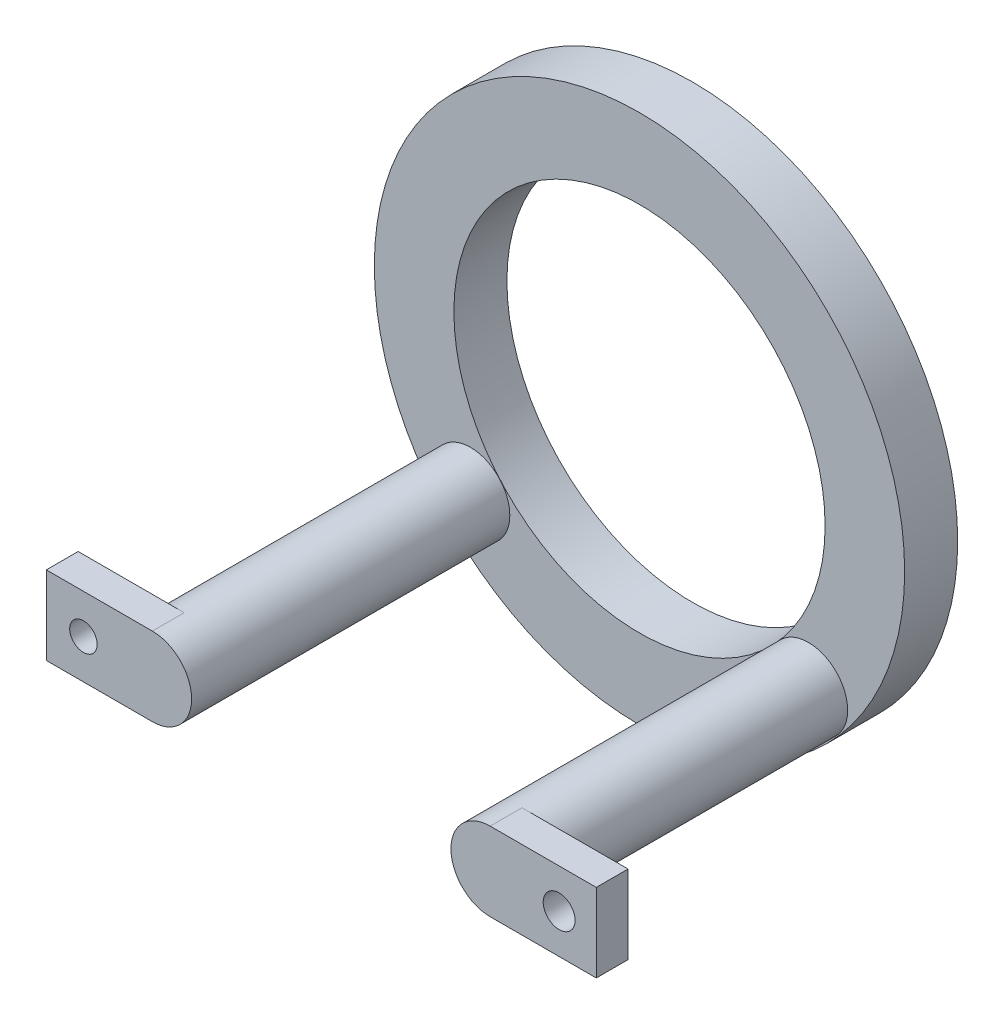
ISO-10303-21;
HEADER;
FILE_DESCRIPTION(('STEP AP214'),'2;1');
FILE_NAME('part.step','',(''),(''),'','','');
FILE_SCHEMA(('AUTOMOTIVE_DESIGN { 1 0 10303 214 1 1 1 1 }'));
ENDSEC;
DATA;
#1=APPLICATION_CONTEXT('core data for automotive mechanical design processes');
#2=APPLICATION_PROTOCOL_DEFINITION('international standard','automotive_design',2000,#1);
#3=PRODUCT_CONTEXT('',#1,'mechanical');
#4=PRODUCT('Part','Part','',(#3));
#5=PRODUCT_RELATED_PRODUCT_CATEGORY('part','',(#4));
#6=PRODUCT_DEFINITION_FORMATION('','',#4);
#7=PRODUCT_DEFINITION_CONTEXT('part definition',#1,'design');
#8=PRODUCT_DEFINITION('design','',#6,#7);
#9=PRODUCT_DEFINITION_SHAPE('','',#8);
#10=(LENGTH_UNIT() NAMED_UNIT(*) SI_UNIT(.MILLI.,.METRE.));
#11=(NAMED_UNIT(*) PLANE_ANGLE_UNIT() SI_UNIT($,.RADIAN.));
#12=(NAMED_UNIT(*) SI_UNIT($,.STERADIAN.) SOLID_ANGLE_UNIT());
#13=UNCERTAINTY_MEASURE_WITH_UNIT(LENGTH_MEASURE(1.E-05),#10,'distance_accuracy_value','');
#14=(GEOMETRIC_REPRESENTATION_CONTEXT(3) GLOBAL_UNCERTAINTY_ASSIGNED_CONTEXT((#13)) GLOBAL_UNIT_ASSIGNED_CONTEXT((#10,
#11,#12)) REPRESENTATION_CONTEXT('',''));
#15=CARTESIAN_POINT('',(0.,0.,0.));
#16=DIRECTION('',(0.,0.,1.));
#17=DIRECTION('',(1.,0.,0.));
#18=AXIS2_PLACEMENT_3D('',#15,#16,#17);
#19=CARTESIAN_POINT('',(0.,0.,10.));
#20=DIRECTION('',(0.,0.,1.));
#21=DIRECTION('',(1.,0.,0.));
#22=AXIS2_PLACEMENT_3D('',#19,#20,#21);
#23=PLANE('',#22);
#24=CARTESIAN_POINT('',(31.85,-28.,10.));
#25=DIRECTION('',(0.,0.,1.));
#26=DIRECTION('',(1.,0.,0.));
#27=AXIS2_PLACEMENT_3D('',#24,#25,#26);
#28=CIRCLE('',#27,7.4);
#29=CARTESIAN_POINT('',(39.25,-28.,10.));
#30=VERTEX_POINT('',#29);
#31=EDGE_CURVE('E202',#30,#30,#28,.F.);
#32=ORIENTED_EDGE('',*,*,#31,.T.);
#33=EDGE_LOOP('',(#32));
#34=FACE_BOUND('',#33,.T.);
#35=CARTESIAN_POINT('',(-31.85,-28.,10.));
#36=DIRECTION('',(0.,0.,1.));
#37=DIRECTION('',(1.,0.,0.));
#38=AXIS2_PLACEMENT_3D('',#35,#36,#37);
#39=CIRCLE('',#38,7.4);
#40=CARTESIAN_POINT('',(-24.45,-28.,10.));
#41=VERTEX_POINT('',#40);
#42=EDGE_CURVE('E209',#41,#41,#39,.F.);
#43=ORIENTED_EDGE('',*,*,#42,.T.);
#44=EDGE_LOOP('',(#43));
#45=FACE_BOUND('',#44,.T.);
#46=CARTESIAN_POINT('',(0.,0.,10.));
#47=DIRECTION('',(0.,0.,1.));
#48=DIRECTION('',(1.,0.,0.));
#49=AXIS2_PLACEMENT_3D('',#46,#47,#48);
#50=CIRCLE('',#49,50.);
#51=CARTESIAN_POINT('',(50.,0.,10.));
#52=VERTEX_POINT('',#51);
#53=EDGE_CURVE('E222',#52,#52,#50,.T.);
#54=ORIENTED_EDGE('',*,*,#53,.T.);
#55=EDGE_LOOP('',(#54));
#56=FACE_BOUND('',#55,.T.);
#57=CARTESIAN_POINT('',(0.,0.,10.));
#58=DIRECTION('',(0.,0.,1.));
#59=DIRECTION('',(1.,0.,0.));
#60=AXIS2_PLACEMENT_3D('',#57,#58,#59);
#61=CIRCLE('',#60,35.);
#62=CARTESIAN_POINT('',(35.,0.,10.));
#63=VERTEX_POINT('',#62);
#64=EDGE_CURVE('E214',#63,#63,#61,.T.);
#65=ORIENTED_EDGE('',*,*,#64,.F.);
#66=EDGE_LOOP('',(#65));
#67=FACE_BOUND('',#66,.T.);
#68=ADVANCED_FACE('F43',(#34,#45,#56,#67),#23,.T.);
#69=CARTESIAN_POINT('',(0.,0.,0.));
#70=DIRECTION('',(0.,0.,1.));
#71=DIRECTION('',(1.,0.,0.));
#72=AXIS2_PLACEMENT_3D('',#69,#70,#71);
#73=PLANE('',#72);
#74=CARTESIAN_POINT('',(0.,0.,0.));
#75=DIRECTION('',(0.,0.,1.));
#76=DIRECTION('',(1.,0.,0.));
#77=AXIS2_PLACEMENT_3D('',#74,#75,#76);
#78=CIRCLE('',#77,50.);
#79=CARTESIAN_POINT('',(50.,0.,0.));
#80=VERTEX_POINT('',#79);
#81=EDGE_CURVE('E218',#80,#80,#78,.T.);
#82=ORIENTED_EDGE('',*,*,#81,.F.);
#83=EDGE_LOOP('',(#82));
#84=FACE_BOUND('',#83,.T.);
#85=CARTESIAN_POINT('',(0.,0.,0.));
#86=DIRECTION('',(0.,0.,1.));
#87=DIRECTION('',(1.,0.,0.));
#88=AXIS2_PLACEMENT_3D('',#85,#86,#87);
#89=CIRCLE('',#88,35.);
#90=CARTESIAN_POINT('',(35.,0.,0.));
#91=VERTEX_POINT('',#90);
#92=EDGE_CURVE('E213',#91,#91,#89,.T.);
#93=ORIENTED_EDGE('',*,*,#92,.T.);
#94=EDGE_LOOP('',(#93));
#95=FACE_BOUND('',#94,.T.);
#96=ADVANCED_FACE('F267',(#84,#95),#73,.F.);
#97=CARTESIAN_POINT('',(0.,0.,10.));
#98=DIRECTION('',(0.,0.,-1.));
#99=DIRECTION('',(-1.,0.,0.));
#100=AXIS2_PLACEMENT_3D('',#97,#98,#99);
#101=CYLINDRICAL_SURFACE('',#100,50.);
#102=ORIENTED_EDGE('',*,*,#53,.F.);
#103=EDGE_LOOP('',(#102));
#104=FACE_BOUND('',#103,.T.);
#105=ORIENTED_EDGE('',*,*,#81,.T.);
#106=EDGE_LOOP('',(#105));
#107=FACE_BOUND('',#106,.T.);
#108=ADVANCED_FACE('F45',(#104,#107),#101,.T.);
#109=CARTESIAN_POINT('',(0.,0.,10.));
#110=DIRECTION('',(0.,0.,-1.));
#111=DIRECTION('',(-1.,0.,0.));
#112=AXIS2_PLACEMENT_3D('',#109,#110,#111);
#113=CYLINDRICAL_SURFACE('',#112,35.);
#114=ORIENTED_EDGE('',*,*,#64,.T.);
#115=EDGE_LOOP('',(#114));
#116=FACE_BOUND('',#115,.T.);
#117=ORIENTED_EDGE('',*,*,#92,.F.);
#118=EDGE_LOOP('',(#117));
#119=FACE_BOUND('',#118,.T.);
#120=ADVANCED_FACE('F276',(#116,#119),#113,.F.);
#121=CARTESIAN_POINT('',(-31.85,-28.,70.));
#122=DIRECTION('',(0.,0.,-1.));
#123=DIRECTION('',(-1.,0.,0.));
#124=AXIS2_PLACEMENT_3D('',#121,#122,#123);
#125=CYLINDRICAL_SURFACE('',#124,7.4);
#126=ORIENTED_EDGE('',*,*,#42,.F.);
#127=EDGE_LOOP('',(#126));
#128=FACE_BOUND('',#127,.T.);
#129=CARTESIAN_POINT('',(-31.85,-28.,70.));
#130=DIRECTION('',(0.,0.,1.));
#131=DIRECTION('',(1.,0.,0.));
#132=AXIS2_PLACEMENT_3D('',#129,#130,#131);
#133=CIRCLE('',#132,7.4);
#134=CARTESIAN_POINT('',(-31.85,-35.4,70.));
#135=VERTEX_POINT('',#134);
#136=CARTESIAN_POINT('',(-31.85,-20.6,70.));
#137=VERTEX_POINT('',#136);
#138=EDGE_CURVE('E206',#135,#137,#133,.T.);
#139=ORIENTED_EDGE('',*,*,#138,.F.);
#140=DIRECTION('',(0.,0.,1.));
#141=VECTOR('',#140,1.);
#142=CARTESIAN_POINT('',(-31.85,-35.4,64.));
#143=LINE('',#142,#141);
#144=CARTESIAN_POINT('',(-31.85,-35.4,64.));
#145=VERTEX_POINT('',#144);
#146=EDGE_CURVE('E187',#145,#135,#143,.T.);
#147=ORIENTED_EDGE('',*,*,#146,.F.);
#148=CARTESIAN_POINT('',(-31.85,-28.,64.));
#149=DIRECTION('',(0.,0.,-1.));
#150=DIRECTION('',(-1.,0.,0.));
#151=AXIS2_PLACEMENT_3D('',#148,#149,#150);
#152=CIRCLE('',#151,7.4);
#153=CARTESIAN_POINT('',(-31.85,-20.6,64.));
#154=VERTEX_POINT('',#153);
#155=EDGE_CURVE('E52',#145,#154,#152,.T.);
#156=ORIENTED_EDGE('',*,*,#155,.T.);
#157=DIRECTION('',(0.,0.,1.));
#158=VECTOR('',#157,1.);
#159=CARTESIAN_POINT('',(-31.85,-20.6,64.));
#160=LINE('',#159,#158);
#161=EDGE_CURVE('E178',#154,#137,#160,.T.);
#162=ORIENTED_EDGE('',*,*,#161,.T.);
#163=EDGE_LOOP('',(#139,#147,#156,#162));
#164=FACE_BOUND('',#163,.T.);
#165=ADVANCED_FACE('F233',(#128,#164),#125,.T.);
#166=CARTESIAN_POINT('',(-31.85,-28.,70.));
#167=DIRECTION('',(0.,0.,1.));
#168=DIRECTION('',(1.,0.,0.));
#169=AXIS2_PLACEMENT_3D('',#166,#167,#168);
#170=PLANE('',#169);
#171=ORIENTED_EDGE('',*,*,#138,.T.);
#172=DIRECTION('',(-1.,0.,0.));
#173=VECTOR('',#172,1.);
#174=CARTESIAN_POINT('',(-31.85,-20.6,70.));
#175=LINE('',#174,#173);
#176=CARTESIAN_POINT('',(-51.85,-20.6,70.));
#177=VERTEX_POINT('',#176);
#178=EDGE_CURVE('E162',#137,#177,#175,.T.);
#179=ORIENTED_EDGE('',*,*,#178,.T.);
#180=DIRECTION('',(0.,-1.,0.));
#181=VECTOR('',#180,1.);
#182=CARTESIAN_POINT('',(-51.85,-20.6,70.));
#183=LINE('',#182,#181);
#184=CARTESIAN_POINT('',(-51.85,-35.4,70.));
#185=VERTEX_POINT('',#184);
#186=EDGE_CURVE('E182',#177,#185,#183,.T.);
#187=ORIENTED_EDGE('',*,*,#186,.T.);
#188=DIRECTION('',(1.,0.,0.));
#189=VECTOR('',#188,1.);
#190=CARTESIAN_POINT('',(-31.85,-35.4,70.));
#191=LINE('',#190,#189);
#192=EDGE_CURVE('E67',#185,#135,#191,.T.);
#193=ORIENTED_EDGE('',*,*,#192,.T.);
#194=EDGE_LOOP('',(#171,#179,#187,#193));
#195=FACE_BOUND('',#194,.T.);
#196=CARTESIAN_POINT('',(-44.85,-28.,70.));
#197=DIRECTION('',(0.,0.,1.));
#198=DIRECTION('',(1.,0.,0.));
#199=AXIS2_PLACEMENT_3D('',#196,#197,#198);
#200=CIRCLE('',#199,2.58812574089736);
#201=CARTESIAN_POINT('',(-42.2618742591026,-28.,70.));
#202=VERTEX_POINT('',#201);
#203=EDGE_CURVE('E154',#202,#202,#200,.T.);
#204=ORIENTED_EDGE('',*,*,#203,.F.);
#205=EDGE_LOOP('',(#204));
#206=FACE_BOUND('',#205,.T.);
#207=ADVANCED_FACE('F247',(#195,#206),#170,.T.);
#208=CARTESIAN_POINT('',(31.85,-28.,70.));
#209=DIRECTION('',(0.,0.,-1.));
#210=DIRECTION('',(-1.,0.,0.));
#211=AXIS2_PLACEMENT_3D('',#208,#209,#210);
#212=CYLINDRICAL_SURFACE('',#211,7.4);
#213=ORIENTED_EDGE('',*,*,#31,.F.);
#214=EDGE_LOOP('',(#213));
#215=FACE_BOUND('',#214,.T.);
#216=CARTESIAN_POINT('',(31.85,-28.,70.));
#217=DIRECTION('',(0.,0.,1.));
#218=DIRECTION('',(1.,0.,0.));
#219=AXIS2_PLACEMENT_3D('',#216,#217,#218);
#220=CIRCLE('',#219,7.4);
#221=CARTESIAN_POINT('',(31.85,-20.6,70.));
#222=VERTEX_POINT('',#221);
#223=CARTESIAN_POINT('',(31.85,-35.4,70.));
#224=VERTEX_POINT('',#223);
#225=EDGE_CURVE('E190',#222,#224,#220,.T.);
#226=ORIENTED_EDGE('',*,*,#225,.F.);
#227=DIRECTION('',(0.,0.,1.));
#228=VECTOR('',#227,1.);
#229=CARTESIAN_POINT('',(31.85,-20.6,64.));
#230=LINE('',#229,#228);
#231=CARTESIAN_POINT('',(31.85,-20.6,64.));
#232=VERTEX_POINT('',#231);
#233=EDGE_CURVE('E123',#232,#222,#230,.T.);
#234=ORIENTED_EDGE('',*,*,#233,.F.);
#235=CARTESIAN_POINT('',(31.85,-28.,64.));
#236=DIRECTION('',(0.,0.,1.));
#237=DIRECTION('',(1.,0.,0.));
#238=AXIS2_PLACEMENT_3D('',#235,#236,#237);
#239=CIRCLE('',#238,7.4);
#240=CARTESIAN_POINT('',(31.85,-35.4,64.));
#241=VERTEX_POINT('',#240);
#242=EDGE_CURVE('E11',#241,#232,#239,.T.);
#243=ORIENTED_EDGE('',*,*,#242,.F.);
#244=DIRECTION('',(0.,0.,1.));
#245=VECTOR('',#244,1.);
#246=CARTESIAN_POINT('',(31.85,-35.4,64.));
#247=LINE('',#246,#245);
#248=EDGE_CURVE('E147',#241,#224,#247,.T.);
#249=ORIENTED_EDGE('',*,*,#248,.T.);
#250=EDGE_LOOP('',(#226,#234,#243,#249));
#251=FACE_BOUND('',#250,.T.);
#252=ADVANCED_FACE('F250',(#215,#251),#212,.T.);
#253=CARTESIAN_POINT('',(31.85,-28.,70.));
#254=DIRECTION('',(0.,0.,1.));
#255=DIRECTION('',(1.,0.,0.));
#256=AXIS2_PLACEMENT_3D('',#253,#254,#255);
#257=PLANE('',#256);
#258=ORIENTED_EDGE('',*,*,#225,.T.);
#259=DIRECTION('',(1.,0.,0.));
#260=VECTOR('',#259,1.);
#261=CARTESIAN_POINT('',(31.85,-35.4,70.));
#262=LINE('',#261,#260);
#263=CARTESIAN_POINT('',(51.85,-35.4,70.));
#264=VERTEX_POINT('',#263);
#265=EDGE_CURVE('E127',#224,#264,#262,.T.);
#266=ORIENTED_EDGE('',*,*,#265,.T.);
#267=DIRECTION('',(0.,1.,0.));
#268=VECTOR('',#267,1.);
#269=CARTESIAN_POINT('',(51.85,-20.6,70.));
#270=LINE('',#269,#268);
#271=CARTESIAN_POINT('',(51.85,-20.6,70.));
#272=VERTEX_POINT('',#271);
#273=EDGE_CURVE('E114',#264,#272,#270,.T.);
#274=ORIENTED_EDGE('',*,*,#273,.T.);
#275=DIRECTION('',(-1.,0.,0.));
#276=VECTOR('',#275,1.);
#277=CARTESIAN_POINT('',(31.85,-20.6,70.));
#278=LINE('',#277,#276);
#279=EDGE_CURVE('E59',#272,#222,#278,.T.);
#280=ORIENTED_EDGE('',*,*,#279,.T.);
#281=EDGE_LOOP('',(#258,#266,#274,#280));
#282=FACE_BOUND('',#281,.T.);
#283=CARTESIAN_POINT('',(44.85,-28.,70.));
#284=DIRECTION('',(0.,0.,1.));
#285=DIRECTION('',(1.,0.,0.));
#286=AXIS2_PLACEMENT_3D('',#283,#284,#285);
#287=CIRCLE('',#286,3.00370921990789);
#288=CARTESIAN_POINT('',(47.8537092199079,-28.,70.));
#289=VERTEX_POINT('',#288);
#290=EDGE_CURVE('E150',#289,#289,#287,.T.);
#291=ORIENTED_EDGE('',*,*,#290,.F.);
#292=EDGE_LOOP('',(#291));
#293=FACE_BOUND('',#292,.T.);
#294=ADVANCED_FACE('F125',(#282,#293),#257,.T.);
#295=CARTESIAN_POINT('',(-31.85,-35.4,64.));
#296=DIRECTION('',(0.,-1.,0.));
#297=DIRECTION('',(0.,0.,-1.));
#298=AXIS2_PLACEMENT_3D('',#295,#296,#297);
#299=PLANE('',#298);
#300=ORIENTED_EDGE('',*,*,#192,.F.);
#301=DIRECTION('',(0.,0.,1.));
#302=VECTOR('',#301,1.);
#303=CARTESIAN_POINT('',(-51.85,-35.4,64.));
#304=LINE('',#303,#302);
#305=CARTESIAN_POINT('',(-51.85,-35.4,64.));
#306=VERTEX_POINT('',#305);
#307=EDGE_CURVE('E191',#306,#185,#304,.T.);
#308=ORIENTED_EDGE('',*,*,#307,.F.);
#309=DIRECTION('',(1.,0.,0.));
#310=VECTOR('',#309,1.);
#311=CARTESIAN_POINT('',(-31.85,-35.4,64.));
#312=LINE('',#311,#310);
#313=EDGE_CURVE('E174',#306,#145,#312,.T.);
#314=ORIENTED_EDGE('',*,*,#313,.T.);
#315=ORIENTED_EDGE('',*,*,#146,.T.);
#316=EDGE_LOOP('',(#300,#308,#314,#315));
#317=FACE_BOUND('',#316,.T.);
#318=ADVANCED_FACE('F241',(#317),#299,.T.);
#319=CARTESIAN_POINT('',(-51.85,-20.6,64.));
#320=DIRECTION('',(-1.,0.,0.));
#321=DIRECTION('',(0.,0.,1.));
#322=AXIS2_PLACEMENT_3D('',#319,#320,#321);
#323=PLANE('',#322);
#324=ORIENTED_EDGE('',*,*,#186,.F.);
#325=DIRECTION('',(0.,0.,1.));
#326=VECTOR('',#325,1.);
#327=CARTESIAN_POINT('',(-51.85,-20.6,64.));
#328=LINE('',#327,#326);
#329=CARTESIAN_POINT('',(-51.85,-20.6,64.));
#330=VERTEX_POINT('',#329);
#331=EDGE_CURVE('E194',#330,#177,#328,.T.);
#332=ORIENTED_EDGE('',*,*,#331,.F.);
#333=DIRECTION('',(0.,-1.,0.));
#334=VECTOR('',#333,1.);
#335=CARTESIAN_POINT('',(-51.85,-20.6,64.));
#336=LINE('',#335,#334);
#337=EDGE_CURVE('E170',#330,#306,#336,.T.);
#338=ORIENTED_EDGE('',*,*,#337,.T.);
#339=ORIENTED_EDGE('',*,*,#307,.T.);
#340=EDGE_LOOP('',(#324,#332,#338,#339));
#341=FACE_BOUND('',#340,.T.);
#342=ADVANCED_FACE('F244',(#341),#323,.T.);
#343=CARTESIAN_POINT('',(-31.85,-20.6,64.));
#344=DIRECTION('',(0.,1.,0.));
#345=DIRECTION('',(-1.,0.,0.));
#346=AXIS2_PLACEMENT_3D('',#343,#344,#345);
#347=PLANE('',#346);
#348=ORIENTED_EDGE('',*,*,#178,.F.);
#349=ORIENTED_EDGE('',*,*,#161,.F.);
#350=DIRECTION('',(-1.,0.,0.));
#351=VECTOR('',#350,1.);
#352=CARTESIAN_POINT('',(-31.85,-20.6,64.));
#353=LINE('',#352,#351);
#354=EDGE_CURVE('E166',#154,#330,#353,.T.);
#355=ORIENTED_EDGE('',*,*,#354,.T.);
#356=ORIENTED_EDGE('',*,*,#331,.T.);
#357=EDGE_LOOP('',(#348,#349,#355,#356));
#358=FACE_BOUND('',#357,.T.);
#359=ADVANCED_FACE('F246',(#358),#347,.T.);
#360=CARTESIAN_POINT('',(0.,0.,64.));
#361=DIRECTION('',(0.,0.,-1.));
#362=DIRECTION('',(-1.,0.,0.));
#363=AXIS2_PLACEMENT_3D('',#360,#361,#362);
#364=PLANE('',#363);
#365=ORIENTED_EDGE('',*,*,#155,.F.);
#366=ORIENTED_EDGE('',*,*,#313,.F.);
#367=ORIENTED_EDGE('',*,*,#337,.F.);
#368=ORIENTED_EDGE('',*,*,#354,.F.);
#369=EDGE_LOOP('',(#365,#366,#367,#368));
#370=FACE_BOUND('',#369,.T.);
#371=CARTESIAN_POINT('',(-44.85,-28.,64.));
#372=DIRECTION('',(0.,0.,1.));
#373=DIRECTION('',(1.,0.,0.));
#374=AXIS2_PLACEMENT_3D('',#371,#372,#373);
#375=CIRCLE('',#374,2.58812574089736);
#376=CARTESIAN_POINT('',(-42.2618742591026,-28.,64.));
#377=VERTEX_POINT('',#376);
#378=EDGE_CURVE('E158',#377,#377,#375,.T.);
#379=ORIENTED_EDGE('',*,*,#378,.T.);
#380=EDGE_LOOP('',(#379));
#381=FACE_BOUND('',#380,.T.);
#382=ADVANCED_FACE('F237',(#370,#381),#364,.T.);
#383=CARTESIAN_POINT('',(-44.85,-28.,64.));
#384=DIRECTION('',(0.,0.,1.));
#385=DIRECTION('',(1.,0.,0.));
#386=AXIS2_PLACEMENT_3D('',#383,#384,#385);
#387=CYLINDRICAL_SURFACE('',#386,2.58812574089736);
#388=ORIENTED_EDGE('',*,*,#378,.F.);
#389=EDGE_LOOP('',(#388));
#390=FACE_BOUND('',#389,.T.);
#391=ORIENTED_EDGE('',*,*,#203,.T.);
#392=EDGE_LOOP('',(#391));
#393=FACE_BOUND('',#392,.T.);
#394=ADVANCED_FACE('F254',(#390,#393),#387,.F.);
#395=CARTESIAN_POINT('',(31.85,-20.6,64.));
#396=DIRECTION('',(0.,1.,0.));
#397=DIRECTION('',(0.,0.,1.));
#398=AXIS2_PLACEMENT_3D('',#395,#396,#397);
#399=PLANE('',#398);
#400=ORIENTED_EDGE('',*,*,#279,.F.);
#401=DIRECTION('',(0.,0.,1.));
#402=VECTOR('',#401,1.);
#403=CARTESIAN_POINT('',(51.85,-20.6,64.));
#404=LINE('',#403,#402);
#405=CARTESIAN_POINT('',(51.85,-20.6,64.));
#406=VERTEX_POINT('',#405);
#407=EDGE_CURVE('E112',#406,#272,#404,.T.);
#408=ORIENTED_EDGE('',*,*,#407,.F.);
#409=DIRECTION('',(-1.,0.,0.));
#410=VECTOR('',#409,1.);
#411=CARTESIAN_POINT('',(31.85,-20.6,64.));
#412=LINE('',#411,#410);
#413=EDGE_CURVE('E144',#406,#232,#412,.T.);
#414=ORIENTED_EDGE('',*,*,#413,.T.);
#415=ORIENTED_EDGE('',*,*,#233,.T.);
#416=EDGE_LOOP('',(#400,#408,#414,#415));
#417=FACE_BOUND('',#416,.T.);
#418=ADVANCED_FACE('F130',(#417),#399,.T.);
#419=CARTESIAN_POINT('',(51.85,-20.6,64.));
#420=DIRECTION('',(1.,0.,0.));
#421=DIRECTION('',(0.,0.,-1.));
#422=AXIS2_PLACEMENT_3D('',#419,#420,#421);
#423=PLANE('',#422);
#424=ORIENTED_EDGE('',*,*,#273,.F.);
#425=DIRECTION('',(0.,0.,1.));
#426=VECTOR('',#425,1.);
#427=CARTESIAN_POINT('',(51.85,-35.4,64.));
#428=LINE('',#427,#426);
#429=CARTESIAN_POINT('',(51.85,-35.4,64.));
#430=VERTEX_POINT('',#429);
#431=EDGE_CURVE('E122',#430,#264,#428,.T.);
#432=ORIENTED_EDGE('',*,*,#431,.F.);
#433=DIRECTION('',(0.,1.,0.));
#434=VECTOR('',#433,1.);
#435=CARTESIAN_POINT('',(51.85,-20.6,64.));
#436=LINE('',#435,#434);
#437=EDGE_CURVE('E117',#430,#406,#436,.T.);
#438=ORIENTED_EDGE('',*,*,#437,.T.);
#439=ORIENTED_EDGE('',*,*,#407,.T.);
#440=EDGE_LOOP('',(#424,#432,#438,#439));
#441=FACE_BOUND('',#440,.T.);
#442=ADVANCED_FACE('F113',(#441),#423,.T.);
#443=CARTESIAN_POINT('',(31.85,-35.4,64.));
#444=DIRECTION('',(0.,-1.,0.));
#445=DIRECTION('',(0.,0.,-1.));
#446=AXIS2_PLACEMENT_3D('',#443,#444,#445);
#447=PLANE('',#446);
#448=ORIENTED_EDGE('',*,*,#265,.F.);
#449=ORIENTED_EDGE('',*,*,#248,.F.);
#450=DIRECTION('',(1.,0.,0.));
#451=VECTOR('',#450,1.);
#452=CARTESIAN_POINT('',(31.85,-35.4,64.));
#453=LINE('',#452,#451);
#454=EDGE_CURVE('E134',#241,#430,#453,.T.);
#455=ORIENTED_EDGE('',*,*,#454,.T.);
#456=ORIENTED_EDGE('',*,*,#431,.T.);
#457=EDGE_LOOP('',(#448,#449,#455,#456));
#458=FACE_BOUND('',#457,.T.);
#459=ADVANCED_FACE('F331',(#458),#447,.T.);
#460=CARTESIAN_POINT('',(0.,0.,64.));
#461=DIRECTION('',(0.,0.,1.));
#462=DIRECTION('',(1.,0.,0.));
#463=AXIS2_PLACEMENT_3D('',#460,#461,#462);
#464=PLANE('',#463);
#465=CARTESIAN_POINT('',(44.85,-28.,64.));
#466=DIRECTION('',(0.,0.,1.));
#467=DIRECTION('',(1.,0.,0.));
#468=AXIS2_PLACEMENT_3D('',#465,#466,#467);
#469=CIRCLE('',#468,3.00370921990789);
#470=CARTESIAN_POINT('',(47.8537092199079,-28.,64.));
#471=VERTEX_POINT('',#470);
#472=EDGE_CURVE('E143',#471,#471,#469,.T.);
#473=ORIENTED_EDGE('',*,*,#472,.T.);
#474=EDGE_LOOP('',(#473));
#475=FACE_BOUND('',#474,.T.);
#476=ORIENTED_EDGE('',*,*,#454,.F.);
#477=ORIENTED_EDGE('',*,*,#242,.T.);
#478=ORIENTED_EDGE('',*,*,#413,.F.);
#479=ORIENTED_EDGE('',*,*,#437,.F.);
#480=EDGE_LOOP('',(#476,#477,#478,#479));
#481=FACE_BOUND('',#480,.T.);
#482=ADVANCED_FACE('F341',(#475,#481),#464,.F.);
#483=CARTESIAN_POINT('',(44.85,-28.,64.));
#484=DIRECTION('',(0.,0.,1.));
#485=DIRECTION('',(1.,0.,0.));
#486=AXIS2_PLACEMENT_3D('',#483,#484,#485);
#487=CYLINDRICAL_SURFACE('',#486,3.00370921990789);
#488=ORIENTED_EDGE('',*,*,#472,.F.);
#489=EDGE_LOOP('',(#488));
#490=FACE_BOUND('',#489,.T.);
#491=ORIENTED_EDGE('',*,*,#290,.T.);
#492=EDGE_LOOP('',(#491));
#493=FACE_BOUND('',#492,.T.);
#494=ADVANCED_FACE('F352',(#490,#493),#487,.F.);
#495=CLOSED_SHELL('',(#68,#96,#108,#120,#165,#207,#252,#294,#318,#342,#359,#382,#394,#418,#442,
#459,#482,#494));
#496=MANIFOLD_SOLID_BREP('B2',#495);
#497=ADVANCED_BREP_SHAPE_REPRESENTATION('',(#18,#496),#14);
#498=SHAPE_DEFINITION_REPRESENTATION(#9,#497);
ENDSEC;
END-ISO-10303-21;
